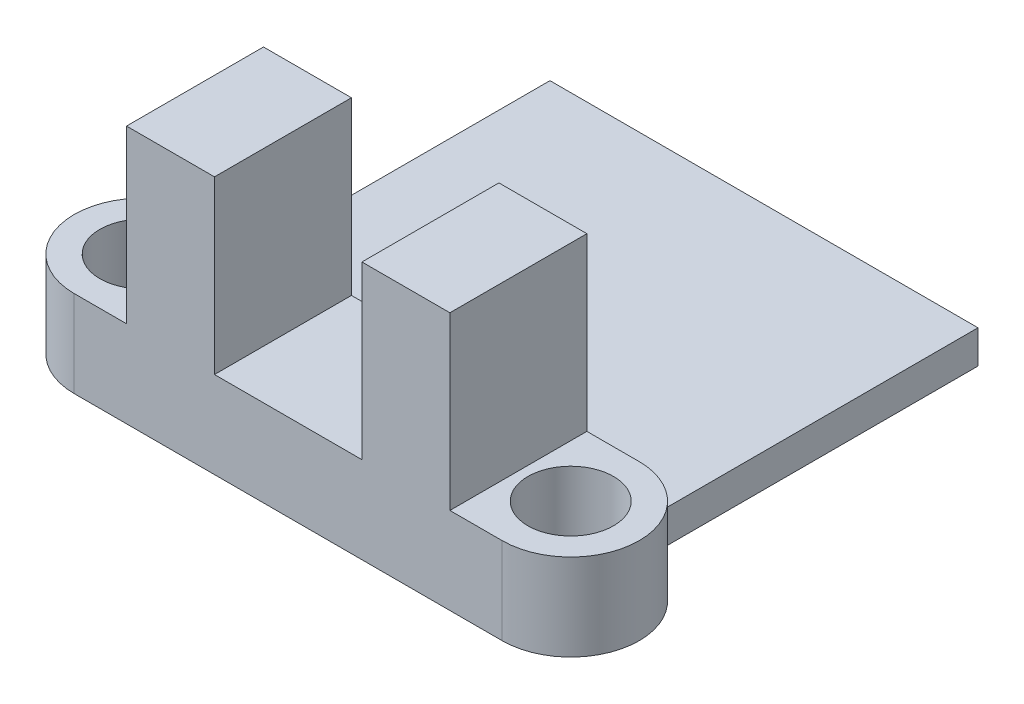
ISO-10303-21;
HEADER;
FILE_DESCRIPTION(('STEP AP214'),'2;1');
FILE_NAME('part.step','',(''),(''),'','','');
FILE_SCHEMA(('AUTOMOTIVE_DESIGN { 1 0 10303 214 1 1 1 1 }'));
ENDSEC;
DATA;
#1=APPLICATION_CONTEXT('core data for automotive mechanical design processes');
#2=APPLICATION_PROTOCOL_DEFINITION('international standard','automotive_design',2000,#1);
#3=PRODUCT_CONTEXT('',#1,'mechanical');
#4=PRODUCT('Part','Part','',(#3));
#5=PRODUCT_RELATED_PRODUCT_CATEGORY('part','',(#4));
#6=PRODUCT_DEFINITION_FORMATION('','',#4);
#7=PRODUCT_DEFINITION_CONTEXT('part definition',#1,'design');
#8=PRODUCT_DEFINITION('design','',#6,#7);
#9=PRODUCT_DEFINITION_SHAPE('','',#8);
#10=(LENGTH_UNIT() NAMED_UNIT(*) SI_UNIT(.MILLI.,.METRE.));
#11=(NAMED_UNIT(*) PLANE_ANGLE_UNIT() SI_UNIT($,.RADIAN.));
#12=(NAMED_UNIT(*) SI_UNIT($,.STERADIAN.) SOLID_ANGLE_UNIT());
#13=UNCERTAINTY_MEASURE_WITH_UNIT(LENGTH_MEASURE(1.E-05),#10,'distance_accuracy_value','');
#14=(GEOMETRIC_REPRESENTATION_CONTEXT(3) GLOBAL_UNCERTAINTY_ASSIGNED_CONTEXT((#13)) GLOBAL_UNIT_ASSIGNED_CONTEXT((#10,
#11,#12)) REPRESENTATION_CONTEXT('',''));
#15=CARTESIAN_POINT('',(0.,0.,0.));
#16=DIRECTION('',(0.,0.,1.));
#17=DIRECTION('',(1.,0.,0.));
#18=AXIS2_PLACEMENT_3D('',#15,#16,#17);
#19=CARTESIAN_POINT('',(-10.,4.05,7.915));
#20=DIRECTION('',(0.,1.,0.));
#21=DIRECTION('',(0.,0.,1.));
#22=AXIS2_PLACEMENT_3D('',#19,#20,#21);
#23=PLANE('',#22);
#24=CARTESIAN_POINT('',(10.,4.05,7.915));
#25=DIRECTION('',(0.,1.,0.));
#26=DIRECTION('',(0.,0.,1.));
#27=AXIS2_PLACEMENT_3D('',#24,#25,#26);
#28=CIRCLE('',#27,2.);
#29=CARTESIAN_POINT('',(10.,4.05,9.915));
#30=VERTEX_POINT('',#29);
#31=EDGE_CURVE('E505',#30,#30,#28,.T.);
#32=ORIENTED_EDGE('',*,*,#31,.F.);
#33=EDGE_LOOP('',(#32));
#34=FACE_BOUND('',#33,.T.);
#35=DIRECTION('',(-1.,0.,0.));
#36=VECTOR('',#35,1.);
#37=CARTESIAN_POINT('',(-10.,4.05,4.715));
#38=LINE('',#37,#36);
#39=CARTESIAN_POINT('',(10.,4.05,4.715));
#40=VERTEX_POINT('',#39);
#41=CARTESIAN_POINT('',(7.55499999999999,4.05,4.715));
#42=VERTEX_POINT('',#41);
#43=EDGE_CURVE('E201',#40,#42,#38,.T.);
#44=ORIENTED_EDGE('',*,*,#43,.T.);
#45=DIRECTION('',(0.,0.,-1.));
#46=VECTOR('',#45,1.);
#47=CARTESIAN_POINT('',(7.555,4.05,11.115));
#48=LINE('',#47,#46);
#49=CARTESIAN_POINT('',(7.55499999999999,4.05,11.115));
#50=VERTEX_POINT('',#49);
#51=EDGE_CURVE('E51',#50,#42,#48,.T.);
#52=ORIENTED_EDGE('',*,*,#51,.F.);
#53=DIRECTION('',(1.,0.,0.));
#54=VECTOR('',#53,1.);
#55=CARTESIAN_POINT('',(-10.,4.05,11.115));
#56=LINE('',#55,#54);
#57=CARTESIAN_POINT('',(10.,4.05,11.115));
#58=VERTEX_POINT('',#57);
#59=EDGE_CURVE('E37',#50,#58,#56,.T.);
#60=ORIENTED_EDGE('',*,*,#59,.T.);
#61=CARTESIAN_POINT('',(10.,4.05,7.915));
#62=DIRECTION('',(0.,1.,0.));
#63=DIRECTION('',(0.,0.,1.));
#64=AXIS2_PLACEMENT_3D('',#61,#62,#63);
#65=CIRCLE('',#64,3.2);
#66=EDGE_CURVE('E206',#58,#40,#65,.T.);
#67=ORIENTED_EDGE('',*,*,#66,.T.);
#68=EDGE_LOOP('',(#44,#52,#60,#67));
#69=FACE_BOUND('',#68,.T.);
#70=ADVANCED_FACE('F33',(#34,#69),#23,.T.);
#71=CARTESIAN_POINT('',(-3.445,4.05,11.115));
#72=VERTEX_POINT('',#71);
#73=CARTESIAN_POINT('',(3.44499999999999,4.05,11.115));
#74=VERTEX_POINT('',#73);
#75=EDGE_CURVE('E59',#72,#74,#56,.T.);
#76=ORIENTED_EDGE('',*,*,#75,.T.);
#77=DIRECTION('',(0.,0.,1.));
#78=VECTOR('',#77,1.);
#79=CARTESIAN_POINT('',(3.445,4.05,11.115));
#80=LINE('',#79,#78);
#81=CARTESIAN_POINT('',(3.445,4.05,4.715));
#82=VERTEX_POINT('',#81);
#83=EDGE_CURVE('E165',#82,#74,#80,.T.);
#84=ORIENTED_EDGE('',*,*,#83,.F.);
#85=CARTESIAN_POINT('',(-3.445,4.05,4.715));
#86=VERTEX_POINT('',#85);
#87=EDGE_CURVE('E199',#82,#86,#38,.T.);
#88=ORIENTED_EDGE('',*,*,#87,.T.);
#89=DIRECTION('',(0.,0.,-1.));
#90=VECTOR('',#89,1.);
#91=CARTESIAN_POINT('',(-3.445,4.05,11.115));
#92=LINE('',#91,#90);
#93=EDGE_CURVE('E168',#72,#86,#92,.T.);
#94=ORIENTED_EDGE('',*,*,#93,.F.);
#95=EDGE_LOOP('',(#76,#84,#88,#94));
#96=FACE_BOUND('',#95,.T.);
#97=ADVANCED_FACE('F263',(#96),#23,.T.);
#98=CARTESIAN_POINT('',(-10.,1.55,-11.115));
#99=DIRECTION('',(0.,0.,1.));
#100=DIRECTION('',(1.,0.,0.));
#101=AXIS2_PLACEMENT_3D('',#98,#99,#100);
#102=PLANE('',#101);
#103=DIRECTION('',(-1.,0.,0.));
#104=VECTOR('',#103,1.);
#105=CARTESIAN_POINT('',(-10.,0.,-11.115));
#106=LINE('',#105,#104);
#107=CARTESIAN_POINT('',(10.,0.,-11.115));
#108=VERTEX_POINT('',#107);
#109=CARTESIAN_POINT('',(-10.,0.,-11.115));
#110=VERTEX_POINT('',#109);
#111=EDGE_CURVE('E294',#108,#110,#106,.T.);
#112=ORIENTED_EDGE('',*,*,#111,.T.);
#113=DIRECTION('',(0.,-1.,0.));
#114=VECTOR('',#113,1.);
#115=CARTESIAN_POINT('',(-10.,1.55,-11.115));
#116=LINE('',#115,#114);
#117=CARTESIAN_POINT('',(-10.,1.55,-11.115));
#118=VERTEX_POINT('',#117);
#119=EDGE_CURVE('E11',#118,#110,#116,.T.);
#120=ORIENTED_EDGE('',*,*,#119,.F.);
#121=DIRECTION('',(-1.,0.,0.));
#122=VECTOR('',#121,1.);
#123=CARTESIAN_POINT('',(-10.,1.55,-11.115));
#124=LINE('',#123,#122);
#125=CARTESIAN_POINT('',(10.,1.55,-11.115));
#126=VERTEX_POINT('',#125);
#127=EDGE_CURVE('E317',#126,#118,#124,.T.);
#128=ORIENTED_EDGE('',*,*,#127,.F.);
#129=DIRECTION('',(0.,-1.,0.));
#130=VECTOR('',#129,1.);
#131=CARTESIAN_POINT('',(10.,1.55,-11.115));
#132=LINE('',#131,#130);
#133=EDGE_CURVE('E297',#126,#108,#132,.T.);
#134=ORIENTED_EDGE('',*,*,#133,.T.);
#135=EDGE_LOOP('',(#112,#120,#128,#134));
#136=FACE_BOUND('',#135,.T.);
#137=ADVANCED_FACE('F35',(#136),#102,.F.);
#138=CARTESIAN_POINT('',(-10.,1.55,4.715));
#139=DIRECTION('',(1.,0.,0.));
#140=DIRECTION('',(0.,0.,-1.));
#141=AXIS2_PLACEMENT_3D('',#138,#139,#140);
#142=PLANE('',#141);
#143=DIRECTION('',(0.,0.,1.));
#144=VECTOR('',#143,1.);
#145=CARTESIAN_POINT('',(-10.,0.,4.715));
#146=LINE('',#145,#144);
#147=CARTESIAN_POINT('',(-10.,0.,4.715));
#148=VERTEX_POINT('',#147);
#149=EDGE_CURVE('E300',#110,#148,#146,.T.);
#150=ORIENTED_EDGE('',*,*,#149,.T.);
#151=DIRECTION('',(0.,-1.,0.));
#152=VECTOR('',#151,1.);
#153=CARTESIAN_POINT('',(-10.,1.55,4.715));
#154=LINE('',#153,#152);
#155=CARTESIAN_POINT('',(-10.,1.55,4.715));
#156=VERTEX_POINT('',#155);
#157=EDGE_CURVE('E43',#156,#148,#154,.T.);
#158=ORIENTED_EDGE('',*,*,#157,.F.);
#159=DIRECTION('',(0.,0.,1.));
#160=VECTOR('',#159,1.);
#161=CARTESIAN_POINT('',(-10.,1.55,4.715));
#162=LINE('',#161,#160);
#163=EDGE_CURVE('E342',#118,#156,#162,.T.);
#164=ORIENTED_EDGE('',*,*,#163,.F.);
#165=ORIENTED_EDGE('',*,*,#119,.T.);
#166=EDGE_LOOP('',(#150,#158,#164,#165));
#167=FACE_BOUND('',#166,.T.);
#168=ADVANCED_FACE('F283',(#167),#142,.F.);
#169=CARTESIAN_POINT('',(-10.,1.55,7.915));
#170=DIRECTION('',(0.,-1.,0.));
#171=DIRECTION('',(0.,0.,-1.));
#172=AXIS2_PLACEMENT_3D('',#169,#170,#171);
#173=CYLINDRICAL_SURFACE('',#172,3.2);
#174=CARTESIAN_POINT('',(-10.,0.,7.915));
#175=DIRECTION('',(0.,1.,0.));
#176=DIRECTION('',(0.,0.,1.));
#177=AXIS2_PLACEMENT_3D('',#174,#175,#176);
#178=CIRCLE('',#177,3.2);
#179=CARTESIAN_POINT('',(-10.,0.,11.115));
#180=VERTEX_POINT('',#179);
#181=EDGE_CURVE('E303',#148,#180,#178,.T.);
#182=ORIENTED_EDGE('',*,*,#181,.T.);
#183=DIRECTION('',(0.,-1.,0.));
#184=VECTOR('',#183,1.);
#185=CARTESIAN_POINT('',(-10.,1.55,11.115));
#186=LINE('',#185,#184);
#187=CARTESIAN_POINT('',(-10.,4.05,11.115));
#188=VERTEX_POINT('',#187);
#189=EDGE_CURVE('E325',#188,#180,#186,.T.);
#190=ORIENTED_EDGE('',*,*,#189,.F.);
#191=CARTESIAN_POINT('',(-10.,4.05,7.915));
#192=DIRECTION('',(0.,1.,0.));
#193=DIRECTION('',(0.,0.,1.));
#194=AXIS2_PLACEMENT_3D('',#191,#192,#193);
#195=CIRCLE('',#194,3.2);
#196=CARTESIAN_POINT('',(-10.,4.05,4.715));
#197=VERTEX_POINT('',#196);
#198=EDGE_CURVE('E219',#197,#188,#195,.T.);
#199=ORIENTED_EDGE('',*,*,#198,.F.);
#200=DIRECTION('',(0.,-1.,0.));
#201=VECTOR('',#200,1.);
#202=CARTESIAN_POINT('',(-10.,4.05,4.715));
#203=LINE('',#202,#201);
#204=EDGE_CURVE('E215',#197,#156,#203,.T.);
#205=ORIENTED_EDGE('',*,*,#204,.T.);
#206=ORIENTED_EDGE('',*,*,#157,.T.);
#207=EDGE_LOOP('',(#182,#190,#199,#205,#206));
#208=FACE_BOUND('',#207,.T.);
#209=ADVANCED_FACE('F288',(#208),#173,.T.);
#210=CARTESIAN_POINT('',(-10.,1.55,11.115));
#211=DIRECTION('',(0.,0.,-1.));
#212=DIRECTION('',(-1.,0.,0.));
#213=AXIS2_PLACEMENT_3D('',#210,#211,#212);
#214=PLANE('',#213);
#215=DIRECTION('',(1.,0.,0.));
#216=VECTOR('',#215,1.);
#217=CARTESIAN_POINT('',(-10.,0.,11.115));
#218=LINE('',#217,#216);
#219=CARTESIAN_POINT('',(10.,0.,11.115));
#220=VERTEX_POINT('',#219);
#221=EDGE_CURVE('E311',#180,#220,#218,.T.);
#222=ORIENTED_EDGE('',*,*,#221,.T.);
#223=DIRECTION('',(0.,-1.,0.));
#224=VECTOR('',#223,1.);
#225=CARTESIAN_POINT('',(10.,1.55,11.115));
#226=LINE('',#225,#224);
#227=EDGE_CURVE('E322',#58,#220,#226,.T.);
#228=ORIENTED_EDGE('',*,*,#227,.F.);
#229=ORIENTED_EDGE('',*,*,#59,.F.);
#230=DIRECTION('',(0.,-1.,0.));
#231=VECTOR('',#230,1.);
#232=CARTESIAN_POINT('',(7.555,12.05,11.115));
#233=LINE('',#232,#231);
#234=CARTESIAN_POINT('',(7.555,12.05,11.115));
#235=VERTEX_POINT('',#234);
#236=EDGE_CURVE('E517',#235,#50,#233,.T.);
#237=ORIENTED_EDGE('',*,*,#236,.F.);
#238=DIRECTION('',(1.,0.,0.));
#239=VECTOR('',#238,1.);
#240=CARTESIAN_POINT('',(3.445,12.05,11.115));
#241=LINE('',#240,#239);
#242=CARTESIAN_POINT('',(3.445,12.05,11.115));
#243=VERTEX_POINT('',#242);
#244=EDGE_CURVE('E161',#243,#235,#241,.T.);
#245=ORIENTED_EDGE('',*,*,#244,.F.);
#246=DIRECTION('',(0.,-1.,0.));
#247=VECTOR('',#246,1.);
#248=CARTESIAN_POINT('',(3.445,12.05,11.115));
#249=LINE('',#248,#247);
#250=EDGE_CURVE('E173',#243,#74,#249,.T.);
#251=ORIENTED_EDGE('',*,*,#250,.T.);
#252=ORIENTED_EDGE('',*,*,#75,.F.);
#253=DIRECTION('',(0.,-1.,0.));
#254=VECTOR('',#253,1.);
#255=CARTESIAN_POINT('',(-3.445,12.05,11.115));
#256=LINE('',#255,#254);
#257=CARTESIAN_POINT('',(-3.445,12.05,11.115));
#258=VERTEX_POINT('',#257);
#259=EDGE_CURVE('E186',#258,#72,#256,.T.);
#260=ORIENTED_EDGE('',*,*,#259,.F.);
#261=DIRECTION('',(1.,0.,0.));
#262=VECTOR('',#261,1.);
#263=CARTESIAN_POINT('',(-7.555,12.05,11.115));
#264=LINE('',#263,#262);
#265=CARTESIAN_POINT('',(-7.555,12.05,11.115));
#266=VERTEX_POINT('',#265);
#267=EDGE_CURVE('E184',#266,#258,#264,.T.);
#268=ORIENTED_EDGE('',*,*,#267,.F.);
#269=DIRECTION('',(0.,-1.,0.));
#270=VECTOR('',#269,1.);
#271=CARTESIAN_POINT('',(-7.555,12.05,11.115));
#272=LINE('',#271,#270);
#273=CARTESIAN_POINT('',(-7.555,4.05,11.115));
#274=VERTEX_POINT('',#273);
#275=EDGE_CURVE('E197',#266,#274,#272,.T.);
#276=ORIENTED_EDGE('',*,*,#275,.T.);
#277=EDGE_CURVE('E217',#188,#274,#56,.T.);
#278=ORIENTED_EDGE('',*,*,#277,.F.);
#279=ORIENTED_EDGE('',*,*,#189,.T.);
#280=EDGE_LOOP('',(#222,#228,#229,#237,#245,#251,#252,#260,#268,#276,#278,#279));
#281=FACE_BOUND('',#280,.T.);
#282=ADVANCED_FACE('F250',(#281),#214,.F.);
#283=CARTESIAN_POINT('',(10.,1.55,7.915));
#284=DIRECTION('',(0.,-1.,0.));
#285=DIRECTION('',(0.,0.,-1.));
#286=AXIS2_PLACEMENT_3D('',#283,#284,#285);
#287=CYLINDRICAL_SURFACE('',#286,3.2);
#288=CARTESIAN_POINT('',(10.,0.,7.915));
#289=DIRECTION('',(0.,1.,0.));
#290=DIRECTION('',(0.,0.,1.));
#291=AXIS2_PLACEMENT_3D('',#288,#289,#290);
#292=CIRCLE('',#291,3.2);
#293=CARTESIAN_POINT('',(10.,0.,4.715));
#294=VERTEX_POINT('',#293);
#295=EDGE_CURVE('E313',#220,#294,#292,.T.);
#296=ORIENTED_EDGE('',*,*,#295,.T.);
#297=DIRECTION('',(0.,-1.,0.));
#298=VECTOR('',#297,1.);
#299=CARTESIAN_POINT('',(10.,1.55,4.715));
#300=LINE('',#299,#298);
#301=CARTESIAN_POINT('',(10.,1.55,4.715));
#302=VERTEX_POINT('',#301);
#303=EDGE_CURVE('E319',#302,#294,#300,.T.);
#304=ORIENTED_EDGE('',*,*,#303,.F.);
#305=DIRECTION('',(0.,-1.,0.));
#306=VECTOR('',#305,1.);
#307=CARTESIAN_POINT('',(10.,4.05,4.715));
#308=LINE('',#307,#306);
#309=EDGE_CURVE('E301',#40,#302,#308,.T.);
#310=ORIENTED_EDGE('',*,*,#309,.F.);
#311=ORIENTED_EDGE('',*,*,#66,.F.);
#312=ORIENTED_EDGE('',*,*,#227,.T.);
#313=EDGE_LOOP('',(#296,#304,#310,#311,#312));
#314=FACE_BOUND('',#313,.T.);
#315=ADVANCED_FACE('F335',(#314),#287,.T.);
#316=CARTESIAN_POINT('',(10.,1.55,4.715));
#317=DIRECTION('',(-1.,0.,0.));
#318=DIRECTION('',(0.,0.,1.));
#319=AXIS2_PLACEMENT_3D('',#316,#317,#318);
#320=PLANE('',#319);
#321=DIRECTION('',(0.,0.,-1.));
#322=VECTOR('',#321,1.);
#323=CARTESIAN_POINT('',(10.,0.,4.715));
#324=LINE('',#323,#322);
#325=EDGE_CURVE('E315',#294,#108,#324,.T.);
#326=ORIENTED_EDGE('',*,*,#325,.T.);
#327=ORIENTED_EDGE('',*,*,#133,.F.);
#328=DIRECTION('',(0.,0.,-1.));
#329=VECTOR('',#328,1.);
#330=CARTESIAN_POINT('',(10.,1.55,4.715));
#331=LINE('',#330,#329);
#332=EDGE_CURVE('E307',#302,#126,#331,.T.);
#333=ORIENTED_EDGE('',*,*,#332,.F.);
#334=ORIENTED_EDGE('',*,*,#303,.T.);
#335=EDGE_LOOP('',(#326,#327,#333,#334));
#336=FACE_BOUND('',#335,.T.);
#337=ADVANCED_FACE('F339',(#336),#320,.F.);
#338=CARTESIAN_POINT('',(10.,1.55,7.915));
#339=DIRECTION('',(0.,1.,0.));
#340=DIRECTION('',(0.,0.,1.));
#341=AXIS2_PLACEMENT_3D('',#338,#339,#340);
#342=PLANE('',#341);
#343=DIRECTION('',(-1.,0.,0.));
#344=VECTOR('',#343,1.);
#345=CARTESIAN_POINT('',(-10.,1.55,4.715));
#346=LINE('',#345,#344);
#347=EDGE_CURVE('E207',#302,#156,#346,.T.);
#348=ORIENTED_EDGE('',*,*,#347,.F.);
#349=ORIENTED_EDGE('',*,*,#332,.T.);
#350=ORIENTED_EDGE('',*,*,#127,.T.);
#351=ORIENTED_EDGE('',*,*,#163,.T.);
#352=EDGE_LOOP('',(#348,#349,#350,#351));
#353=FACE_BOUND('',#352,.T.);
#354=ADVANCED_FACE('F344',(#353),#342,.T.);
#355=CARTESIAN_POINT('',(10.,0.,7.915));
#356=DIRECTION('',(0.,1.,0.));
#357=DIRECTION('',(0.,0.,1.));
#358=AXIS2_PLACEMENT_3D('',#355,#356,#357);
#359=PLANE('',#358);
#360=CARTESIAN_POINT('',(10.,0.,7.915));
#361=DIRECTION('',(0.,1.,0.));
#362=DIRECTION('',(0.,0.,1.));
#363=AXIS2_PLACEMENT_3D('',#360,#361,#362);
#364=CIRCLE('',#363,2.);
#365=CARTESIAN_POINT('',(10.,0.,9.915));
#366=VERTEX_POINT('',#365);
#367=EDGE_CURVE('E502',#366,#366,#364,.T.);
#368=ORIENTED_EDGE('',*,*,#367,.T.);
#369=EDGE_LOOP('',(#368));
#370=FACE_BOUND('',#369,.T.);
#371=CARTESIAN_POINT('',(-10.,0.,7.915));
#372=DIRECTION('',(0.,1.,0.));
#373=DIRECTION('',(0.,0.,1.));
#374=AXIS2_PLACEMENT_3D('',#371,#372,#373);
#375=CIRCLE('',#374,2.);
#376=CARTESIAN_POINT('',(-10.,0.,9.915));
#377=VERTEX_POINT('',#376);
#378=EDGE_CURVE('E510',#377,#377,#375,.T.);
#379=ORIENTED_EDGE('',*,*,#378,.T.);
#380=EDGE_LOOP('',(#379));
#381=FACE_BOUND('',#380,.T.);
#382=ORIENTED_EDGE('',*,*,#111,.F.);
#383=ORIENTED_EDGE('',*,*,#325,.F.);
#384=ORIENTED_EDGE('',*,*,#295,.F.);
#385=ORIENTED_EDGE('',*,*,#221,.F.);
#386=ORIENTED_EDGE('',*,*,#181,.F.);
#387=ORIENTED_EDGE('',*,*,#149,.F.);
#388=EDGE_LOOP('',(#382,#383,#384,#385,#386,#387));
#389=FACE_BOUND('',#388,.T.);
#390=ADVANCED_FACE('F272',(#370,#381,#389),#359,.F.);
#391=CARTESIAN_POINT('',(-10.,4.05,4.715));
#392=DIRECTION('',(0.,0.,1.));
#393=DIRECTION('',(1.,0.,0.));
#394=AXIS2_PLACEMENT_3D('',#391,#392,#393);
#395=PLANE('',#394);
#396=ORIENTED_EDGE('',*,*,#347,.T.);
#397=ORIENTED_EDGE('',*,*,#204,.F.);
#398=CARTESIAN_POINT('',(-7.555,4.05,4.715));
#399=VERTEX_POINT('',#398);
#400=EDGE_CURVE('E202',#399,#197,#38,.T.);
#401=ORIENTED_EDGE('',*,*,#400,.F.);
#402=DIRECTION('',(0.,-1.,0.));
#403=VECTOR('',#402,1.);
#404=CARTESIAN_POINT('',(-7.555,12.05,4.715));
#405=LINE('',#404,#403);
#406=CARTESIAN_POINT('',(-7.555,12.05,4.715));
#407=VERTEX_POINT('',#406);
#408=EDGE_CURVE('E230',#407,#399,#405,.T.);
#409=ORIENTED_EDGE('',*,*,#408,.F.);
#410=DIRECTION('',(-1.,0.,0.));
#411=VECTOR('',#410,1.);
#412=CARTESIAN_POINT('',(-7.555,12.05,4.715));
#413=LINE('',#412,#411);
#414=CARTESIAN_POINT('',(-3.445,12.05,4.715));
#415=VERTEX_POINT('',#414);
#416=EDGE_CURVE('E180',#415,#407,#413,.T.);
#417=ORIENTED_EDGE('',*,*,#416,.F.);
#418=DIRECTION('',(0.,-1.,0.));
#419=VECTOR('',#418,1.);
#420=CARTESIAN_POINT('',(-3.445,12.05,4.715));
#421=LINE('',#420,#419);
#422=EDGE_CURVE('E225',#415,#86,#421,.T.);
#423=ORIENTED_EDGE('',*,*,#422,.T.);
#424=ORIENTED_EDGE('',*,*,#87,.F.);
#425=DIRECTION('',(0.,-1.,0.));
#426=VECTOR('',#425,1.);
#427=CARTESIAN_POINT('',(3.445,12.05,4.715));
#428=LINE('',#427,#426);
#429=CARTESIAN_POINT('',(3.445,12.05,4.715));
#430=VERTEX_POINT('',#429);
#431=EDGE_CURVE('E152',#430,#82,#428,.T.);
#432=ORIENTED_EDGE('',*,*,#431,.F.);
#433=DIRECTION('',(-1.,0.,0.));
#434=VECTOR('',#433,1.);
#435=CARTESIAN_POINT('',(3.445,12.05,4.715));
#436=LINE('',#435,#434);
#437=CARTESIAN_POINT('',(7.555,12.05,4.715));
#438=VERTEX_POINT('',#437);
#439=EDGE_CURVE('E144',#438,#430,#436,.T.);
#440=ORIENTED_EDGE('',*,*,#439,.F.);
#441=DIRECTION('',(0.,-1.,0.));
#442=VECTOR('',#441,1.);
#443=CARTESIAN_POINT('',(7.555,12.05,4.715));
#444=LINE('',#443,#442);
#445=EDGE_CURVE('E150',#438,#42,#444,.T.);
#446=ORIENTED_EDGE('',*,*,#445,.T.);
#447=ORIENTED_EDGE('',*,*,#43,.F.);
#448=ORIENTED_EDGE('',*,*,#309,.T.);
#449=EDGE_LOOP('',(#396,#397,#401,#409,#417,#423,#424,#432,#440,#446,#447,#448));
#450=FACE_BOUND('',#449,.T.);
#451=ADVANCED_FACE('F147',(#450),#395,.F.);
#452=CARTESIAN_POINT('',(-10.,4.05,7.915));
#453=DIRECTION('',(0.,1.,0.));
#454=DIRECTION('',(0.,0.,1.));
#455=AXIS2_PLACEMENT_3D('',#452,#453,#454);
#456=CIRCLE('',#455,2.);
#457=CARTESIAN_POINT('',(-10.,4.05,9.915));
#458=VERTEX_POINT('',#457);
#459=EDGE_CURVE('E507',#458,#458,#456,.T.);
#460=ORIENTED_EDGE('',*,*,#459,.F.);
#461=EDGE_LOOP('',(#460));
#462=FACE_BOUND('',#461,.T.);
#463=DIRECTION('',(0.,0.,1.));
#464=VECTOR('',#463,1.);
#465=CARTESIAN_POINT('',(-7.555,4.05,11.115));
#466=LINE('',#465,#464);
#467=EDGE_CURVE('E171',#399,#274,#466,.T.);
#468=ORIENTED_EDGE('',*,*,#467,.F.);
#469=ORIENTED_EDGE('',*,*,#400,.T.);
#470=ORIENTED_EDGE('',*,*,#198,.T.);
#471=ORIENTED_EDGE('',*,*,#277,.T.);
#472=EDGE_LOOP('',(#468,#469,#470,#471));
#473=FACE_BOUND('',#472,.T.);
#474=ADVANCED_FACE('F258',(#462,#473),#23,.T.);
#475=CARTESIAN_POINT('',(-3.445,12.05,11.115));
#476=DIRECTION('',(-1.,0.,0.));
#477=DIRECTION('',(0.,0.,1.));
#478=AXIS2_PLACEMENT_3D('',#475,#476,#477);
#479=PLANE('',#478);
#480=ORIENTED_EDGE('',*,*,#93,.T.);
#481=ORIENTED_EDGE('',*,*,#422,.F.);
#482=DIRECTION('',(0.,0.,-1.));
#483=VECTOR('',#482,1.);
#484=CARTESIAN_POINT('',(-3.445,12.05,11.115));
#485=LINE('',#484,#483);
#486=EDGE_CURVE('E177',#258,#415,#485,.T.);
#487=ORIENTED_EDGE('',*,*,#486,.F.);
#488=ORIENTED_EDGE('',*,*,#259,.T.);
#489=EDGE_LOOP('',(#480,#481,#487,#488));
#490=FACE_BOUND('',#489,.T.);
#491=ADVANCED_FACE('F260',(#490),#479,.F.);
#492=CARTESIAN_POINT('',(-7.555,12.05,11.115));
#493=DIRECTION('',(1.,0.,0.));
#494=DIRECTION('',(0.,0.,-1.));
#495=AXIS2_PLACEMENT_3D('',#492,#493,#494);
#496=PLANE('',#495);
#497=ORIENTED_EDGE('',*,*,#467,.T.);
#498=ORIENTED_EDGE('',*,*,#275,.F.);
#499=DIRECTION('',(0.,0.,1.));
#500=VECTOR('',#499,1.);
#501=CARTESIAN_POINT('',(-7.555,12.05,11.115));
#502=LINE('',#501,#500);
#503=EDGE_CURVE('E182',#407,#266,#502,.T.);
#504=ORIENTED_EDGE('',*,*,#503,.F.);
#505=ORIENTED_EDGE('',*,*,#408,.T.);
#506=EDGE_LOOP('',(#497,#498,#504,#505));
#507=FACE_BOUND('',#506,.T.);
#508=ADVANCED_FACE('F243',(#507),#496,.F.);
#509=CARTESIAN_POINT('',(0.,12.05,0.));
#510=DIRECTION('',(0.,-1.,0.));
#511=DIRECTION('',(0.,0.,-1.));
#512=AXIS2_PLACEMENT_3D('',#509,#510,#511);
#513=PLANE('',#512);
#514=ORIENTED_EDGE('',*,*,#486,.T.);
#515=ORIENTED_EDGE('',*,*,#416,.T.);
#516=ORIENTED_EDGE('',*,*,#503,.T.);
#517=ORIENTED_EDGE('',*,*,#267,.T.);
#518=EDGE_LOOP('',(#514,#515,#516,#517));
#519=FACE_BOUND('',#518,.T.);
#520=ADVANCED_FACE('F255',(#519),#513,.F.);
#521=CARTESIAN_POINT('',(7.555,12.05,11.115));
#522=DIRECTION('',(-1.,0.,0.));
#523=DIRECTION('',(0.,0.,1.));
#524=AXIS2_PLACEMENT_3D('',#521,#522,#523);
#525=PLANE('',#524);
#526=ORIENTED_EDGE('',*,*,#51,.T.);
#527=ORIENTED_EDGE('',*,*,#445,.F.);
#528=DIRECTION('',(0.,0.,-1.));
#529=VECTOR('',#528,1.);
#530=CARTESIAN_POINT('',(7.555,12.05,11.115));
#531=LINE('',#530,#529);
#532=EDGE_CURVE('E156',#235,#438,#531,.T.);
#533=ORIENTED_EDGE('',*,*,#532,.F.);
#534=ORIENTED_EDGE('',*,*,#236,.T.);
#535=EDGE_LOOP('',(#526,#527,#533,#534));
#536=FACE_BOUND('',#535,.T.);
#537=ADVANCED_FACE('F167',(#536),#525,.F.);
#538=CARTESIAN_POINT('',(3.445,12.05,11.115));
#539=DIRECTION('',(1.,0.,0.));
#540=DIRECTION('',(0.,0.,-1.));
#541=AXIS2_PLACEMENT_3D('',#538,#539,#540);
#542=PLANE('',#541);
#543=ORIENTED_EDGE('',*,*,#83,.T.);
#544=ORIENTED_EDGE('',*,*,#250,.F.);
#545=DIRECTION('',(0.,0.,1.));
#546=VECTOR('',#545,1.);
#547=CARTESIAN_POINT('',(3.445,12.05,11.115));
#548=LINE('',#547,#546);
#549=EDGE_CURVE('E155',#430,#243,#548,.T.);
#550=ORIENTED_EDGE('',*,*,#549,.F.);
#551=ORIENTED_EDGE('',*,*,#431,.T.);
#552=EDGE_LOOP('',(#543,#544,#550,#551));
#553=FACE_BOUND('',#552,.T.);
#554=ADVANCED_FACE('F451',(#553),#542,.F.);
#555=CARTESIAN_POINT('',(0.,12.05,0.));
#556=DIRECTION('',(0.,-1.,0.));
#557=DIRECTION('',(0.,0.,-1.));
#558=AXIS2_PLACEMENT_3D('',#555,#556,#557);
#559=PLANE('',#558);
#560=ORIENTED_EDGE('',*,*,#532,.T.);
#561=ORIENTED_EDGE('',*,*,#439,.T.);
#562=ORIENTED_EDGE('',*,*,#549,.T.);
#563=ORIENTED_EDGE('',*,*,#244,.T.);
#564=EDGE_LOOP('',(#560,#561,#562,#563));
#565=FACE_BOUND('',#564,.T.);
#566=ADVANCED_FACE('F159',(#565),#559,.F.);
#567=CARTESIAN_POINT('',(-10.,0.,7.915));
#568=DIRECTION('',(0.,1.,0.));
#569=DIRECTION('',(0.,0.,1.));
#570=AXIS2_PLACEMENT_3D('',#567,#568,#569);
#571=CYLINDRICAL_SURFACE('',#570,2.);
#572=ORIENTED_EDGE('',*,*,#378,.F.);
#573=EDGE_LOOP('',(#572));
#574=FACE_BOUND('',#573,.T.);
#575=ORIENTED_EDGE('',*,*,#459,.T.);
#576=EDGE_LOOP('',(#575));
#577=FACE_BOUND('',#576,.T.);
#578=ADVANCED_FACE('F464',(#574,#577),#571,.F.);
#579=CARTESIAN_POINT('',(10.,0.,7.915));
#580=DIRECTION('',(0.,1.,0.));
#581=DIRECTION('',(0.,0.,1.));
#582=AXIS2_PLACEMENT_3D('',#579,#580,#581);
#583=CYLINDRICAL_SURFACE('',#582,2.);
#584=ORIENTED_EDGE('',*,*,#367,.F.);
#585=EDGE_LOOP('',(#584));
#586=FACE_BOUND('',#585,.T.);
#587=ORIENTED_EDGE('',*,*,#31,.T.);
#588=EDGE_LOOP('',(#587));
#589=FACE_BOUND('',#588,.T.);
#590=ADVANCED_FACE('F470',(#586,#589),#583,.F.);
#591=CLOSED_SHELL('',(#70,#97,#137,#168,#209,#282,#315,#337,#354,#390,#451,#474,#491,#508,#520,
#537,#554,#566,#578,#590));
#592=MANIFOLD_SOLID_BREP('B2',#591);
#593=ADVANCED_BREP_SHAPE_REPRESENTATION('',(#18,#592),#14);
#594=SHAPE_DEFINITION_REPRESENTATION(#9,#593);
ENDSEC;
END-ISO-10303-21;
